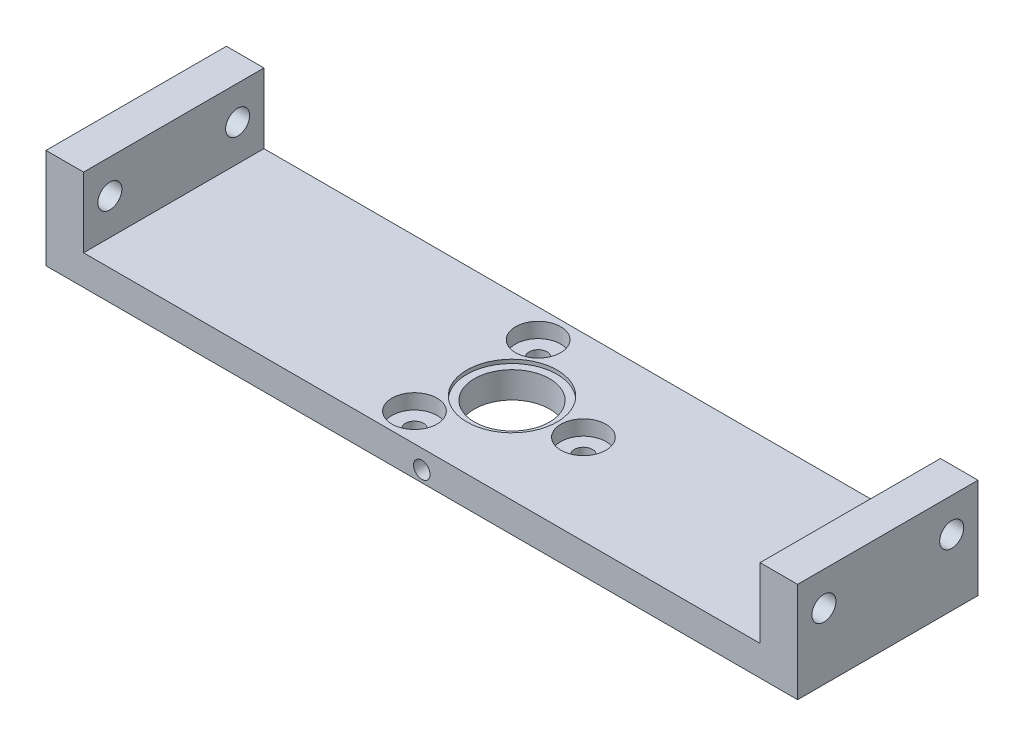
ISO-10303-21;
HEADER;
FILE_DESCRIPTION(('STEP AP214'),'2;1');
FILE_NAME('part.step','',(''),(''),'','','');
FILE_SCHEMA(('AUTOMOTIVE_DESIGN { 1 0 10303 214 1 1 1 1 }'));
ENDSEC;
DATA;
#1=APPLICATION_CONTEXT('core data for automotive mechanical design processes');
#2=APPLICATION_PROTOCOL_DEFINITION('international standard','automotive_design',2000,#1);
#3=PRODUCT_CONTEXT('',#1,'mechanical');
#4=PRODUCT('Part','Part','',(#3));
#5=PRODUCT_RELATED_PRODUCT_CATEGORY('part','',(#4));
#6=PRODUCT_DEFINITION_FORMATION('','',#4);
#7=PRODUCT_DEFINITION_CONTEXT('part definition',#1,'design');
#8=PRODUCT_DEFINITION('design','',#6,#7);
#9=PRODUCT_DEFINITION_SHAPE('','',#8);
#10=(LENGTH_UNIT() NAMED_UNIT(*) SI_UNIT(.MILLI.,.METRE.));
#11=(NAMED_UNIT(*) PLANE_ANGLE_UNIT() SI_UNIT($,.RADIAN.));
#12=(NAMED_UNIT(*) SI_UNIT($,.STERADIAN.) SOLID_ANGLE_UNIT());
#13=UNCERTAINTY_MEASURE_WITH_UNIT(LENGTH_MEASURE(1.E-05),#10,'distance_accuracy_value','');
#14=(GEOMETRIC_REPRESENTATION_CONTEXT(3) GLOBAL_UNCERTAINTY_ASSIGNED_CONTEXT((#13)) GLOBAL_UNIT_ASSIGNED_CONTEXT((#10,
#11,#12)) REPRESENTATION_CONTEXT('',''));
#15=CARTESIAN_POINT('',(0.,0.,0.));
#16=DIRECTION('',(0.,0.,1.));
#17=DIRECTION('',(1.,0.,0.));
#18=AXIS2_PLACEMENT_3D('',#15,#16,#17);
#19=CARTESIAN_POINT('',(0.,0.,0.));
#20=DIRECTION('',(0.,1.,0.));
#21=DIRECTION('',(0.,0.,1.));
#22=AXIS2_PLACEMENT_3D('',#19,#20,#21);
#23=CYLINDRICAL_SURFACE('',#22,5.);
#24=CARTESIAN_POINT('',(0.,0.4,5.));
#25=CARTESIAN_POINT('',(0.0609999595605343,0.400002070744471,4.99999887616071));
#26=CARTESIAN_POINT('',(0.122024864570489,0.405091212620894,4.99887236640976));
#27=CARTESIAN_POINT('',(0.242340682213434,0.425291827060882,4.99448731688896));
#28=CARTESIAN_POINT('',(0.301630334476692,0.440410404510959,4.99122726573313));
#29=CARTESIAN_POINT('',(0.416719495178802,0.480172964020533,4.98293803882235));
#30=CARTESIAN_POINT('',(0.47252259922515,0.504806938177139,4.97791072230238));
#31=CARTESIAN_POINT('',(0.579201800209653,0.562869127389219,4.96662927649014));
#32=CARTESIAN_POINT('',(0.630078013068212,0.59629713546895,4.96037517607224));
#33=CARTESIAN_POINT('',(0.726286472895075,0.671572340540574,4.94721161217635));
#34=CARTESIAN_POINT('',(0.771527352939542,0.713534887419684,4.94029394178491));
#35=CARTESIAN_POINT('',(0.854388619012939,0.804440398808313,4.92664060013215));
#36=CARTESIAN_POINT('',(0.892008319235028,0.853383990846184,4.91990494529707));
#37=CARTESIAN_POINT('',(0.958963471917807,0.957539104713471,4.90729728442084));
#38=CARTESIAN_POINT('',(0.988201468581812,1.01281466135595,4.90143579096535));
#39=CARTESIAN_POINT('',(1.03693806360125,1.12764483611661,4.89135798202062));
#40=CARTESIAN_POINT('',(1.05643784110248,1.18719893517097,4.88714146736376));
#41=CARTESIAN_POINT('',(1.08484213840972,1.30790402706892,4.88091463585407));
#42=CARTESIAN_POINT('',(1.09390852357101,1.36901515579818,4.87887065323906));
#43=CARTESIAN_POINT('',(1.10169200911266,1.4919226238989,4.87711921535008));
#44=CARTESIAN_POINT('',(1.10041039697519,1.55371887707283,4.87741146940503));
#45=CARTESIAN_POINT('',(1.08766448534752,1.6750376788863,4.88026901349544));
#46=CARTESIAN_POINT('',(1.07638840428799,1.73458114182766,4.88279228627149));
#47=CARTESIAN_POINT('',(1.04427191511885,1.85090994244832,4.88976110659631));
#48=CARTESIAN_POINT('',(1.02343096479542,1.90769512356416,4.89420676312045));
#49=CARTESIAN_POINT('',(0.972603991259544,2.01742362343512,4.90456073289075));
#50=CARTESIAN_POINT('',(0.942545752161965,2.07033236312732,4.91048052431651));
#51=CARTESIAN_POINT('',(0.874188211307914,2.17042454548404,4.9231087342744));
#52=CARTESIAN_POINT('',(0.835887773778336,2.21760719769217,4.92981726143629));
#53=CARTESIAN_POINT('',(0.751137532534971,2.30599130859561,4.94344721177288));
#54=CARTESIAN_POINT('',(0.704527725553266,2.3470392724433,4.95037008112472));
#55=CARTESIAN_POINT('',(0.60500727003928,2.42076108260805,4.96351503501933));
#56=CARTESIAN_POINT('',(0.552096504798669,2.45343477377884,4.96973710657756));
#57=CARTESIAN_POINT('',(0.441287511930168,2.50951917630957,4.98079997404393));
#58=CARTESIAN_POINT('',(0.383378689102365,2.53290959052967,4.98563773690336));
#59=CARTESIAN_POINT('',(0.264322427239206,2.56958494318122,4.99336438083546));
#60=CARTESIAN_POINT('',(0.203175466193196,2.58287136866378,4.99625354868486));
#61=CARTESIAN_POINT('',(0.0806951337888037,2.59873790816888,4.99971659049809));
#62=CARTESIAN_POINT('',(0.0193901667559534,2.60152767224174,5.00033579592629));
#63=CARTESIAN_POINT('',(-0.102809855689281,2.59689020331419,4.99931625579903));
#64=CARTESIAN_POINT('',(-0.16370493895761,2.58946367181027,4.99767766527392));
#65=CARTESIAN_POINT('',(-0.282660671832649,2.56477823245189,4.99235527341083));
#66=CARTESIAN_POINT('',(-0.340745292202312,2.54762945611473,4.98869439186058));
#67=CARTESIAN_POINT('',(-0.453213497397116,2.50410869495774,4.97973725216115));
#68=CARTESIAN_POINT('',(-0.507596763912388,2.47773591808446,4.97444085357672));
#69=CARTESIAN_POINT('',(-0.611984174520995,2.41608014452098,4.96268846914328));
#70=CARTESIAN_POINT('',(-0.661913906336793,2.38067420514939,4.95621687062795));
#71=CARTESIAN_POINT('',(-0.755198474721239,2.30211885987565,4.94286351602272));
#72=CARTESIAN_POINT('',(-0.798552445319078,2.25896843572271,4.93598170607748));
#73=CARTESIAN_POINT('',(-0.878285066590893,2.16518648093348,4.9224267180889));
#74=CARTESIAN_POINT('',(-0.914518464326411,2.11443037913633,4.915759829214));
#75=CARTESIAN_POINT('',(-0.977947765230283,2.00743038318787,4.90353605046082));
#76=CARTESIAN_POINT('',(-1.00514406089903,1.95118672750988,4.89797911237922));
#77=CARTESIAN_POINT('',(-1.04954246502567,1.83511055379806,4.88865786141391));
#78=CARTESIAN_POINT('',(-1.06680099884063,1.77530046914941,4.88488345002477));
#79=CARTESIAN_POINT('',(-1.09099877035096,1.65353534619537,4.87953666429121));
#80=CARTESIAN_POINT('',(-1.09793968040361,1.59158065716965,4.87796393308446));
#81=CARTESIAN_POINT('',(-1.10123335923441,1.46875002047652,4.87722125104816));
#82=CARTESIAN_POINT('',(-1.09781649694486,1.40788045337176,4.8779990211444));
#83=CARTESIAN_POINT('',(-1.08100709980942,1.28760725749673,4.88175137242458));
#84=CARTESIAN_POINT('',(-1.06761468536976,1.22820361104154,4.88472592709306));
#85=CARTESIAN_POINT('',(-1.03134622878672,1.11273408423696,4.89251106034219));
#86=CARTESIAN_POINT('',(-1.00850408563874,1.05665708417309,4.89731507127078));
#87=CARTESIAN_POINT('',(-0.954013559326407,0.949097225159446,4.90822032953724));
#88=CARTESIAN_POINT('',(-0.922364246385415,0.897614852024665,4.91432171382331));
#89=CARTESIAN_POINT('',(-0.850395309737892,0.799570860760367,4.92729014360946));
#90=CARTESIAN_POINT('',(-0.809911671979786,0.753131346898307,4.93417029120977));
#91=CARTESIAN_POINT('',(-0.721755168071863,0.667629376971456,4.94783338665195));
#92=CARTESIAN_POINT('',(-0.674080641100263,0.628568629827538,4.95461631164175));
#93=CARTESIAN_POINT('',(-0.572139645762662,0.55844056555829,4.96742659150803));
#94=CARTESIAN_POINT('',(-0.517794695314207,0.527485187588999,4.97344283035884));
#95=CARTESIAN_POINT('',(-0.404551859645521,0.475197401119104,4.98393015925119));
#96=CARTESIAN_POINT('',(-0.345657820131688,0.453856966417843,4.98840253731884));
#97=CARTESIAN_POINT('',(-0.238925637735769,0.425184154059374,4.99450541009833));
#98=CARTESIAN_POINT('',(-0.191662539589551,0.415758204132779,4.99655306675253));
#99=CARTESIAN_POINT('',(-0.0962714475911042,0.403165451708681,4.99930077467044));
#100=CARTESIAN_POINT('',(-0.0481434930158616,0.399998365689539,5.0000008869768));
#101=CARTESIAN_POINT('',(0.,0.4,5.));
#102=B_SPLINE_CURVE_WITH_KNOTS('',3,(#24,#25,#26,#27,#28,#29,#30,#31,#32,#33,#34,#35,#36,#37,
#38,#39,#40,#41,#42,#43,#44,#45,#46,#47,#48,#49,#50,#51,#52,#53,#54,#55,#56,#57,#58,#59,#60,#61,
#62,#63,#64,#65,#66,#67,#68,#69,#70,#71,#72,#73,#74,#75,#76,#77,#78,#79,#80,#81,#82,#83,#84,#85,
#86,#87,#88,#89,#90,#91,#92,#93,#94,#95,#96,#97,#98,#99,#100,#101),.UNSPECIFIED.,.T.,.F.,(4,2,2,
2,2,2,2,2,2,2,2,2,2,2,2,2,2,2,2,2,2,2,2,2,2,2,2,2,2,2,2,2,2,2,2,2,2,2,4),(0.,0.182823646499007,
0.365776944395016,0.548538341185737,0.731295436902254,0.916709868622985,1.10214097782156,
1.28964796472437,1.47713224196011,1.66166688741998,1.84617857371231,2.02728761407923,
2.20840692243349,2.39098318435594,2.57358462137524,2.7601822487278,2.94678333283802,
3.13379018684498,3.32076951285242,3.50399384389164,3.68720559455758,3.86838228153855,
4.04957452975743,4.23337826229003,4.41720617920563,4.6044642781354,4.79171424298788,
4.977890267682,5.1640361122882,5.346072460439,5.52810661142295,5.7094933374829,5.89089921988555,
6.07601342659492,6.26117045329546,6.44876375359555,6.63620016645499,6.78049809308024,
6.92478948297247),.UNSPECIFIED.);
#103=CARTESIAN_POINT('',(0.,0.4,5.));
#104=VERTEX_POINT('',#103);
#105=EDGE_CURVE('E295',#104,#104,#102,.T.);
#106=ORIENTED_EDGE('',*,*,#105,.T.);
#107=EDGE_LOOP('',(#106));
#108=FACE_BOUND('',#107,.T.);
#109=CARTESIAN_POINT('',(0.,0.,0.));
#110=DIRECTION('',(0.,1.,0.));
#111=DIRECTION('',(0.,0.,1.));
#112=AXIS2_PLACEMENT_3D('',#109,#110,#111);
#113=CIRCLE('',#112,5.);
#114=CARTESIAN_POINT('',(0.,0.,5.));
#115=VERTEX_POINT('',#114);
#116=EDGE_CURVE('E224',#115,#115,#113,.T.);
#117=ORIENTED_EDGE('',*,*,#116,.F.);
#118=EDGE_LOOP('',(#117));
#119=FACE_BOUND('',#118,.T.);
#120=CARTESIAN_POINT('',(0.,3.5,0.));
#121=DIRECTION('',(0.,1.,0.));
#122=DIRECTION('',(0.,0.,1.));
#123=AXIS2_PLACEMENT_3D('',#120,#121,#122);
#124=CIRCLE('',#123,5.);
#125=CARTESIAN_POINT('',(0.,3.5,5.));
#126=VERTEX_POINT('',#125);
#127=EDGE_CURVE('E53',#126,#126,#124,.F.);
#128=ORIENTED_EDGE('',*,*,#127,.F.);
#129=EDGE_LOOP('',(#128));
#130=FACE_BOUND('',#129,.T.);
#131=ADVANCED_FACE('F49',(#108,#119,#130),#23,.F.);
#132=CARTESIAN_POINT('',(0.,13.3,0.));
#133=DIRECTION('',(0.,1.,0.));
#134=DIRECTION('',(0.,0.,1.));
#135=AXIS2_PLACEMENT_3D('',#132,#133,#134);
#136=PLANE('',#135);
#137=DIRECTION('',(0.,0.,-1.));
#138=VECTOR('',#137,1.);
#139=CARTESIAN_POINT('',(45.,13.3,-12.));
#140=LINE('',#139,#138);
#141=CARTESIAN_POINT('',(45.,13.3,12.));
#142=VERTEX_POINT('',#141);
#143=CARTESIAN_POINT('',(45.,13.3,-12.));
#144=VERTEX_POINT('',#143);
#145=EDGE_CURVE('E143',#142,#144,#140,.T.);
#146=ORIENTED_EDGE('',*,*,#145,.F.);
#147=DIRECTION('',(1.,0.,0.));
#148=VECTOR('',#147,1.);
#149=CARTESIAN_POINT('',(-50.,13.3,12.));
#150=LINE('',#149,#148);
#151=CARTESIAN_POINT('',(50.,13.3,12.));
#152=VERTEX_POINT('',#151);
#153=EDGE_CURVE('E76',#142,#152,#150,.T.);
#154=ORIENTED_EDGE('',*,*,#153,.T.);
#155=DIRECTION('',(0.,0.,-1.));
#156=VECTOR('',#155,1.);
#157=CARTESIAN_POINT('',(50.,13.3,-12.));
#158=LINE('',#157,#156);
#159=CARTESIAN_POINT('',(50.,13.3,-12.));
#160=VERTEX_POINT('',#159);
#161=EDGE_CURVE('E161',#152,#160,#158,.T.);
#162=ORIENTED_EDGE('',*,*,#161,.T.);
#163=DIRECTION('',(-1.,0.,0.));
#164=VECTOR('',#163,1.);
#165=CARTESIAN_POINT('',(-50.,13.3,-12.));
#166=LINE('',#165,#164);
#167=EDGE_CURVE('E105',#160,#144,#166,.T.);
#168=ORIENTED_EDGE('',*,*,#167,.T.);
#169=EDGE_LOOP('',(#146,#154,#162,#168));
#170=FACE_BOUND('',#169,.T.);
#171=ADVANCED_FACE('F251',(#170),#136,.T.);
#172=CARTESIAN_POINT('',(50.,13.3,-12.));
#173=DIRECTION('',(-1.,0.,0.));
#174=DIRECTION('',(0.,0.,1.));
#175=AXIS2_PLACEMENT_3D('',#172,#173,#174);
#176=PLANE('',#175);
#177=CARTESIAN_POINT('',(50.,8.8,8.5));
#178=DIRECTION('',(1.,0.,0.));
#179=DIRECTION('',(0.,0.,-1.));
#180=AXIS2_PLACEMENT_3D('',#177,#178,#179);
#181=CIRCLE('',#180,1.59999999999999);
#182=CARTESIAN_POINT('',(50.,8.8,6.90000000000001));
#183=VERTEX_POINT('',#182);
#184=EDGE_CURVE('E215',#183,#183,#181,.T.);
#185=ORIENTED_EDGE('',*,*,#184,.F.);
#186=EDGE_LOOP('',(#185));
#187=FACE_BOUND('',#186,.T.);
#188=CARTESIAN_POINT('',(50.,8.8,-8.5));
#189=DIRECTION('',(1.,0.,0.));
#190=DIRECTION('',(0.,0.,-1.));
#191=AXIS2_PLACEMENT_3D('',#188,#189,#190);
#192=CIRCLE('',#191,1.59999999999999);
#193=CARTESIAN_POINT('',(50.,8.8,-10.1));
#194=VERTEX_POINT('',#193);
#195=EDGE_CURVE('E211',#194,#194,#192,.T.);
#196=ORIENTED_EDGE('',*,*,#195,.F.);
#197=EDGE_LOOP('',(#196));
#198=FACE_BOUND('',#197,.T.);
#199=DIRECTION('',(0.,0.,-1.));
#200=VECTOR('',#199,1.);
#201=CARTESIAN_POINT('',(50.,0.,-12.));
#202=LINE('',#201,#200);
#203=CARTESIAN_POINT('',(50.,0.,12.));
#204=VERTEX_POINT('',#203);
#205=CARTESIAN_POINT('',(50.,0.,-12.));
#206=VERTEX_POINT('',#205);
#207=EDGE_CURVE('E174',#204,#206,#202,.T.);
#208=ORIENTED_EDGE('',*,*,#207,.T.);
#209=DIRECTION('',(0.,-1.,0.));
#210=VECTOR('',#209,1.);
#211=CARTESIAN_POINT('',(50.,13.3,-12.));
#212=LINE('',#211,#210);
#213=EDGE_CURVE('E11',#160,#206,#212,.T.);
#214=ORIENTED_EDGE('',*,*,#213,.F.);
#215=ORIENTED_EDGE('',*,*,#161,.F.);
#216=DIRECTION('',(0.,-1.,0.));
#217=VECTOR('',#216,1.);
#218=CARTESIAN_POINT('',(50.,13.3,12.));
#219=LINE('',#218,#217);
#220=EDGE_CURVE('E173',#152,#204,#219,.T.);
#221=ORIENTED_EDGE('',*,*,#220,.T.);
#222=EDGE_LOOP('',(#208,#214,#215,#221));
#223=FACE_BOUND('',#222,.T.);
#224=ADVANCED_FACE('F51',(#187,#198,#223),#176,.F.);
#225=CARTESIAN_POINT('',(-50.,13.3,-12.));
#226=DIRECTION('',(0.,0.,1.));
#227=DIRECTION('',(1.,0.,0.));
#228=AXIS2_PLACEMENT_3D('',#225,#226,#227);
#229=PLANE('',#228);
#230=DIRECTION('',(-1.,0.,0.));
#231=VECTOR('',#230,1.);
#232=CARTESIAN_POINT('',(45.,4.,-12.));
#233=LINE('',#232,#231);
#234=CARTESIAN_POINT('',(45.,4.,-12.));
#235=VERTEX_POINT('',#234);
#236=CARTESIAN_POINT('',(-45.,4.,-12.));
#237=VERTEX_POINT('',#236);
#238=EDGE_CURVE('E135',#235,#237,#233,.T.);
#239=ORIENTED_EDGE('',*,*,#238,.F.);
#240=DIRECTION('',(0.,1.,0.));
#241=VECTOR('',#240,1.);
#242=CARTESIAN_POINT('',(45.,4.,-12.));
#243=LINE('',#242,#241);
#244=EDGE_CURVE('E179',#235,#144,#243,.T.);
#245=ORIENTED_EDGE('',*,*,#244,.T.);
#246=ORIENTED_EDGE('',*,*,#167,.F.);
#247=ORIENTED_EDGE('',*,*,#213,.T.);
#248=DIRECTION('',(-1.,0.,0.));
#249=VECTOR('',#248,1.);
#250=CARTESIAN_POINT('',(-50.,0.,-12.));
#251=LINE('',#250,#249);
#252=CARTESIAN_POINT('',(-50.,0.,-12.));
#253=VERTEX_POINT('',#252);
#254=EDGE_CURVE('E178',#206,#253,#251,.T.);
#255=ORIENTED_EDGE('',*,*,#254,.T.);
#256=DIRECTION('',(0.,-1.,0.));
#257=VECTOR('',#256,1.);
#258=CARTESIAN_POINT('',(-50.,13.3,-12.));
#259=LINE('',#258,#257);
#260=CARTESIAN_POINT('',(-50.,13.3,-12.));
#261=VERTEX_POINT('',#260);
#262=EDGE_CURVE('E59',#261,#253,#259,.T.);
#263=ORIENTED_EDGE('',*,*,#262,.F.);
#264=CARTESIAN_POINT('',(-45.,13.3,-12.));
#265=VERTEX_POINT('',#264);
#266=EDGE_CURVE('E148',#265,#261,#166,.T.);
#267=ORIENTED_EDGE('',*,*,#266,.F.);
#268=DIRECTION('',(0.,1.,0.));
#269=VECTOR('',#268,1.);
#270=CARTESIAN_POINT('',(-45.,4.,-12.));
#271=LINE('',#270,#269);
#272=EDGE_CURVE('E67',#237,#265,#271,.T.);
#273=ORIENTED_EDGE('',*,*,#272,.F.);
#274=EDGE_LOOP('',(#239,#245,#246,#247,#255,#263,#267,#273));
#275=FACE_BOUND('',#274,.T.);
#276=ADVANCED_FACE('F146',(#275),#229,.F.);
#277=CARTESIAN_POINT('',(-50.,13.3,-12.));
#278=DIRECTION('',(1.,0.,0.));
#279=DIRECTION('',(0.,0.,-1.));
#280=AXIS2_PLACEMENT_3D('',#277,#278,#279);
#281=PLANE('',#280);
#282=CARTESIAN_POINT('',(-50.,8.8,8.5));
#283=DIRECTION('',(1.,0.,0.));
#284=DIRECTION('',(0.,0.,-1.));
#285=AXIS2_PLACEMENT_3D('',#282,#283,#284);
#286=CIRCLE('',#285,1.59999999999998);
#287=CARTESIAN_POINT('',(-50.,8.8,6.90000000000002));
#288=VERTEX_POINT('',#287);
#289=EDGE_CURVE('E204',#288,#288,#286,.T.);
#290=ORIENTED_EDGE('',*,*,#289,.T.);
#291=EDGE_LOOP('',(#290));
#292=FACE_BOUND('',#291,.T.);
#293=CARTESIAN_POINT('',(-50.,8.8,-8.5));
#294=DIRECTION('',(1.,0.,0.));
#295=DIRECTION('',(0.,0.,-1.));
#296=AXIS2_PLACEMENT_3D('',#293,#294,#295);
#297=CIRCLE('',#296,1.59999999999998);
#298=CARTESIAN_POINT('',(-50.,8.8,-10.1));
#299=VERTEX_POINT('',#298);
#300=EDGE_CURVE('E199',#299,#299,#297,.T.);
#301=ORIENTED_EDGE('',*,*,#300,.T.);
#302=EDGE_LOOP('',(#301));
#303=FACE_BOUND('',#302,.T.);
#304=DIRECTION('',(0.,0.,1.));
#305=VECTOR('',#304,1.);
#306=CARTESIAN_POINT('',(-50.,0.,-12.));
#307=LINE('',#306,#305);
#308=CARTESIAN_POINT('',(-50.,0.,12.));
#309=VERTEX_POINT('',#308);
#310=EDGE_CURVE('E182',#253,#309,#307,.T.);
#311=ORIENTED_EDGE('',*,*,#310,.T.);
#312=DIRECTION('',(0.,-1.,0.));
#313=VECTOR('',#312,1.);
#314=CARTESIAN_POINT('',(-50.,13.3,12.));
#315=LINE('',#314,#313);
#316=CARTESIAN_POINT('',(-50.,13.3,12.));
#317=VERTEX_POINT('',#316);
#318=EDGE_CURVE('E189',#317,#309,#315,.T.);
#319=ORIENTED_EDGE('',*,*,#318,.F.);
#320=DIRECTION('',(0.,0.,1.));
#321=VECTOR('',#320,1.);
#322=CARTESIAN_POINT('',(-50.,13.3,-12.));
#323=LINE('',#322,#321);
#324=EDGE_CURVE('E166',#261,#317,#323,.T.);
#325=ORIENTED_EDGE('',*,*,#324,.F.);
#326=ORIENTED_EDGE('',*,*,#262,.T.);
#327=EDGE_LOOP('',(#311,#319,#325,#326));
#328=FACE_BOUND('',#327,.T.);
#329=ADVANCED_FACE('F388',(#292,#303,#328),#281,.F.);
#330=CARTESIAN_POINT('',(-50.,13.3,12.));
#331=DIRECTION('',(0.,0.,-1.));
#332=DIRECTION('',(-1.,0.,0.));
#333=AXIS2_PLACEMENT_3D('',#330,#331,#332);
#334=PLANE('',#333);
#335=CARTESIAN_POINT('',(0.,1.5,12.));
#336=DIRECTION('',(0.,0.,1.));
#337=DIRECTION('',(1.,0.,0.));
#338=AXIS2_PLACEMENT_3D('',#335,#336,#337);
#339=CIRCLE('',#338,1.1);
#340=CARTESIAN_POINT('',(1.09999999999999,1.5,12.));
#341=VERTEX_POINT('',#340);
#342=EDGE_CURVE('E300',#341,#341,#339,.T.);
#343=ORIENTED_EDGE('',*,*,#342,.F.);
#344=EDGE_LOOP('',(#343));
#345=FACE_BOUND('',#344,.T.);
#346=ORIENTED_EDGE('',*,*,#153,.F.);
#347=DIRECTION('',(0.,1.,0.));
#348=VECTOR('',#347,1.);
#349=CARTESIAN_POINT('',(45.,4.,12.));
#350=LINE('',#349,#348);
#351=CARTESIAN_POINT('',(45.,4.,12.));
#352=VERTEX_POINT('',#351);
#353=EDGE_CURVE('E155',#352,#142,#350,.T.);
#354=ORIENTED_EDGE('',*,*,#353,.F.);
#355=DIRECTION('',(1.,0.,0.));
#356=VECTOR('',#355,1.);
#357=CARTESIAN_POINT('',(-45.,4.,12.));
#358=LINE('',#357,#356);
#359=CARTESIAN_POINT('',(-45.,4.,12.));
#360=VERTEX_POINT('',#359);
#361=EDGE_CURVE('E134',#360,#352,#358,.T.);
#362=ORIENTED_EDGE('',*,*,#361,.F.);
#363=DIRECTION('',(0.,1.,0.));
#364=VECTOR('',#363,1.);
#365=CARTESIAN_POINT('',(-45.,4.,12.));
#366=LINE('',#365,#364);
#367=CARTESIAN_POINT('',(-45.,13.3,12.));
#368=VERTEX_POINT('',#367);
#369=EDGE_CURVE('E130',#360,#368,#366,.T.);
#370=ORIENTED_EDGE('',*,*,#369,.T.);
#371=EDGE_CURVE('E169',#317,#368,#150,.T.);
#372=ORIENTED_EDGE('',*,*,#371,.F.);
#373=ORIENTED_EDGE('',*,*,#318,.T.);
#374=DIRECTION('',(1.,0.,0.));
#375=VECTOR('',#374,1.);
#376=CARTESIAN_POINT('',(-50.,0.,12.));
#377=LINE('',#376,#375);
#378=EDGE_CURVE('E98',#309,#204,#377,.T.);
#379=ORIENTED_EDGE('',*,*,#378,.T.);
#380=ORIENTED_EDGE('',*,*,#220,.F.);
#381=EDGE_LOOP('',(#346,#354,#362,#370,#372,#373,#379,#380));
#382=FACE_BOUND('',#381,.T.);
#383=ADVANCED_FACE('F252',(#345,#382),#334,.F.);
#384=DIRECTION('',(0.,0.,1.));
#385=VECTOR('',#384,1.);
#386=CARTESIAN_POINT('',(-45.,13.3,-12.));
#387=LINE('',#386,#385);
#388=EDGE_CURVE('E235',#265,#368,#387,.T.);
#389=ORIENTED_EDGE('',*,*,#388,.F.);
#390=ORIENTED_EDGE('',*,*,#266,.T.);
#391=ORIENTED_EDGE('',*,*,#324,.T.);
#392=ORIENTED_EDGE('',*,*,#371,.T.);
#393=EDGE_LOOP('',(#389,#390,#391,#392));
#394=FACE_BOUND('',#393,.T.);
#395=ADVANCED_FACE('F369',(#394),#136,.T.);
#396=CARTESIAN_POINT('',(0.,0.,0.));
#397=DIRECTION('',(0.,1.,0.));
#398=DIRECTION('',(0.,0.,1.));
#399=AXIS2_PLACEMENT_3D('',#396,#397,#398);
#400=PLANE('',#399);
#401=CARTESIAN_POINT('',(-4.74999999999992,0.,8.2272413359522));
#402=DIRECTION('',(0.,1.,0.));
#403=DIRECTION('',(0.,0.,1.));
#404=AXIS2_PLACEMENT_3D('',#401,#402,#403);
#405=CIRCLE('',#404,1.2);
#406=CARTESIAN_POINT('',(-4.74999999999992,0.,9.4272413359522));
#407=VERTEX_POINT('',#406);
#408=EDGE_CURVE('E413',#407,#407,#405,.T.);
#409=ORIENTED_EDGE('',*,*,#408,.T.);
#410=EDGE_LOOP('',(#409));
#411=FACE_BOUND('',#410,.T.);
#412=CARTESIAN_POINT('',(-4.75000000000003,0.,-8.22724133595214));
#413=DIRECTION('',(0.,1.,0.));
#414=DIRECTION('',(0.,0.,1.));
#415=AXIS2_PLACEMENT_3D('',#412,#413,#414);
#416=CIRCLE('',#415,1.2);
#417=CARTESIAN_POINT('',(-4.75000000000003,0.,-7.02724133595214));
#418=VERTEX_POINT('',#417);
#419=EDGE_CURVE('E430',#418,#418,#416,.T.);
#420=ORIENTED_EDGE('',*,*,#419,.T.);
#421=EDGE_LOOP('',(#420));
#422=FACE_BOUND('',#421,.T.);
#423=CARTESIAN_POINT('',(9.49999999999999,0.,0.));
#424=DIRECTION('',(0.,1.,0.));
#425=DIRECTION('',(0.,0.,1.));
#426=AXIS2_PLACEMENT_3D('',#423,#424,#425);
#427=CIRCLE('',#426,1.2);
#428=CARTESIAN_POINT('',(9.49999999999999,0.,1.2));
#429=VERTEX_POINT('',#428);
#430=EDGE_CURVE('E269',#429,#429,#427,.T.);
#431=ORIENTED_EDGE('',*,*,#430,.T.);
#432=EDGE_LOOP('',(#431));
#433=FACE_BOUND('',#432,.T.);
#434=ORIENTED_EDGE('',*,*,#116,.T.);
#435=EDGE_LOOP('',(#434));
#436=FACE_BOUND('',#435,.T.);
#437=ORIENTED_EDGE('',*,*,#207,.F.);
#438=ORIENTED_EDGE('',*,*,#378,.F.);
#439=ORIENTED_EDGE('',*,*,#310,.F.);
#440=ORIENTED_EDGE('',*,*,#254,.F.);
#441=EDGE_LOOP('',(#437,#438,#439,#440));
#442=FACE_BOUND('',#441,.T.);
#443=ADVANCED_FACE('F377',(#411,#422,#433,#436,#442),#400,.F.);
#444=CARTESIAN_POINT('',(45.,4.,-12.));
#445=DIRECTION('',(1.,0.,0.));
#446=DIRECTION('',(0.,0.,-1.));
#447=AXIS2_PLACEMENT_3D('',#444,#445,#446);
#448=PLANE('',#447);
#449=CARTESIAN_POINT('',(45.,8.8,8.5));
#450=DIRECTION('',(1.,0.,0.));
#451=DIRECTION('',(0.,0.,-1.));
#452=AXIS2_PLACEMENT_3D('',#449,#450,#451);
#453=CIRCLE('',#452,1.59999999999998);
#454=CARTESIAN_POINT('',(45.,8.8,6.90000000000002));
#455=VERTEX_POINT('',#454);
#456=EDGE_CURVE('E200',#455,#455,#453,.T.);
#457=ORIENTED_EDGE('',*,*,#456,.T.);
#458=EDGE_LOOP('',(#457));
#459=FACE_BOUND('',#458,.T.);
#460=CARTESIAN_POINT('',(45.,8.8,-8.5));
#461=DIRECTION('',(1.,0.,0.));
#462=DIRECTION('',(0.,0.,-1.));
#463=AXIS2_PLACEMENT_3D('',#460,#461,#462);
#464=CIRCLE('',#463,1.59999999999998);
#465=CARTESIAN_POINT('',(45.,8.8,-10.1));
#466=VERTEX_POINT('',#465);
#467=EDGE_CURVE('E198',#466,#466,#464,.T.);
#468=ORIENTED_EDGE('',*,*,#467,.T.);
#469=EDGE_LOOP('',(#468));
#470=FACE_BOUND('',#469,.T.);
#471=ORIENTED_EDGE('',*,*,#145,.T.);
#472=ORIENTED_EDGE('',*,*,#244,.F.);
#473=DIRECTION('',(0.,0.,-1.));
#474=VECTOR('',#473,1.);
#475=CARTESIAN_POINT('',(45.,4.,-12.));
#476=LINE('',#475,#474);
#477=EDGE_CURVE('E141',#352,#235,#476,.T.);
#478=ORIENTED_EDGE('',*,*,#477,.F.);
#479=ORIENTED_EDGE('',*,*,#353,.T.);
#480=EDGE_LOOP('',(#471,#472,#478,#479));
#481=FACE_BOUND('',#480,.T.);
#482=ADVANCED_FACE('F250',(#459,#470,#481),#448,.F.);
#483=CARTESIAN_POINT('',(-45.,4.,-12.));
#484=DIRECTION('',(-1.,0.,0.));
#485=DIRECTION('',(0.,0.,1.));
#486=AXIS2_PLACEMENT_3D('',#483,#484,#485);
#487=PLANE('',#486);
#488=CARTESIAN_POINT('',(-45.,8.8,8.5));
#489=DIRECTION('',(-1.,0.,0.));
#490=DIRECTION('',(0.,0.,1.));
#491=AXIS2_PLACEMENT_3D('',#488,#489,#490);
#492=CIRCLE('',#491,1.59999999999998);
#493=CARTESIAN_POINT('',(-45.,8.8,10.1));
#494=VERTEX_POINT('',#493);
#495=EDGE_CURVE('E203',#494,#494,#492,.T.);
#496=ORIENTED_EDGE('',*,*,#495,.T.);
#497=EDGE_LOOP('',(#496));
#498=FACE_BOUND('',#497,.T.);
#499=CARTESIAN_POINT('',(-45.,8.8,-8.5));
#500=DIRECTION('',(-1.,0.,0.));
#501=DIRECTION('',(0.,0.,1.));
#502=AXIS2_PLACEMENT_3D('',#499,#500,#501);
#503=CIRCLE('',#502,1.59999999999998);
#504=CARTESIAN_POINT('',(-45.,8.8,-6.90000000000002));
#505=VERTEX_POINT('',#504);
#506=EDGE_CURVE('E195',#505,#505,#503,.T.);
#507=ORIENTED_EDGE('',*,*,#506,.T.);
#508=EDGE_LOOP('',(#507));
#509=FACE_BOUND('',#508,.T.);
#510=ORIENTED_EDGE('',*,*,#388,.T.);
#511=ORIENTED_EDGE('',*,*,#369,.F.);
#512=DIRECTION('',(0.,0.,1.));
#513=VECTOR('',#512,1.);
#514=CARTESIAN_POINT('',(-45.,4.,-12.));
#515=LINE('',#514,#513);
#516=EDGE_CURVE('E126',#237,#360,#515,.T.);
#517=ORIENTED_EDGE('',*,*,#516,.F.);
#518=ORIENTED_EDGE('',*,*,#272,.T.);
#519=EDGE_LOOP('',(#510,#511,#517,#518));
#520=FACE_BOUND('',#519,.T.);
#521=ADVANCED_FACE('F128',(#498,#509,#520),#487,.F.);
#522=CARTESIAN_POINT('',(0.,4.,0.));
#523=DIRECTION('',(0.,1.,0.));
#524=DIRECTION('',(0.,0.,1.));
#525=AXIS2_PLACEMENT_3D('',#522,#523,#524);
#526=PLANE('',#525);
#527=CARTESIAN_POINT('',(-4.74999999999992,4.,8.2272413359522));
#528=DIRECTION('',(0.,1.,0.));
#529=DIRECTION('',(0.,0.,1.));
#530=AXIS2_PLACEMENT_3D('',#527,#528,#529);
#531=CIRCLE('',#530,3.);
#532=CARTESIAN_POINT('',(-4.74999999999992,4.,11.2272413359522));
#533=VERTEX_POINT('',#532);
#534=EDGE_CURVE('E286',#533,#533,#531,.T.);
#535=ORIENTED_EDGE('',*,*,#534,.F.);
#536=EDGE_LOOP('',(#535));
#537=FACE_BOUND('',#536,.T.);
#538=CARTESIAN_POINT('',(-4.75000000000003,4.,-8.22724133595214));
#539=DIRECTION('',(0.,1.,0.));
#540=DIRECTION('',(0.,0.,1.));
#541=AXIS2_PLACEMENT_3D('',#538,#539,#540);
#542=CIRCLE('',#541,3.);
#543=CARTESIAN_POINT('',(-4.75000000000003,4.,-5.22724133595214));
#544=VERTEX_POINT('',#543);
#545=EDGE_CURVE('E415',#544,#544,#542,.T.);
#546=ORIENTED_EDGE('',*,*,#545,.F.);
#547=EDGE_LOOP('',(#546));
#548=FACE_BOUND('',#547,.T.);
#549=CARTESIAN_POINT('',(9.49999999999999,4.,0.));
#550=DIRECTION('',(0.,1.,0.));
#551=DIRECTION('',(0.,0.,1.));
#552=AXIS2_PLACEMENT_3D('',#549,#550,#551);
#553=CIRCLE('',#552,3.);
#554=CARTESIAN_POINT('',(9.49999999999999,4.,3.));
#555=VERTEX_POINT('',#554);
#556=EDGE_CURVE('E406',#555,#555,#553,.T.);
#557=ORIENTED_EDGE('',*,*,#556,.F.);
#558=EDGE_LOOP('',(#557));
#559=FACE_BOUND('',#558,.T.);
#560=CARTESIAN_POINT('',(0.,4.,0.));
#561=DIRECTION('',(0.,1.,0.));
#562=DIRECTION('',(0.,0.,1.));
#563=AXIS2_PLACEMENT_3D('',#560,#561,#562);
#564=CIRCLE('',#563,6.);
#565=CARTESIAN_POINT('',(0.,4.,6.));
#566=VERTEX_POINT('',#565);
#567=EDGE_CURVE('E410',#566,#566,#564,.T.);
#568=ORIENTED_EDGE('',*,*,#567,.F.);
#569=EDGE_LOOP('',(#568));
#570=FACE_BOUND('',#569,.T.);
#571=ORIENTED_EDGE('',*,*,#238,.T.);
#572=ORIENTED_EDGE('',*,*,#516,.T.);
#573=ORIENTED_EDGE('',*,*,#361,.T.);
#574=ORIENTED_EDGE('',*,*,#477,.T.);
#575=EDGE_LOOP('',(#571,#572,#573,#574));
#576=FACE_BOUND('',#575,.T.);
#577=ADVANCED_FACE('F139',(#537,#548,#559,#570,#576),#526,.T.);
#578=CARTESIAN_POINT('',(50.,8.8,-8.5));
#579=DIRECTION('',(1.,0.,0.));
#580=DIRECTION('',(0.,0.,-1.));
#581=AXIS2_PLACEMENT_3D('',#578,#579,#580);
#582=CYLINDRICAL_SURFACE('',#581,1.59999999999998);
#583=ORIENTED_EDGE('',*,*,#300,.F.);
#584=EDGE_LOOP('',(#583));
#585=FACE_BOUND('',#584,.T.);
#586=ORIENTED_EDGE('',*,*,#506,.F.);
#587=EDGE_LOOP('',(#586));
#588=FACE_BOUND('',#587,.T.);
#589=ADVANCED_FACE('F455',(#585,#588),#582,.F.);
#590=ORIENTED_EDGE('',*,*,#195,.T.);
#591=EDGE_LOOP('',(#590));
#592=FACE_BOUND('',#591,.T.);
#593=ORIENTED_EDGE('',*,*,#467,.F.);
#594=EDGE_LOOP('',(#593));
#595=FACE_BOUND('',#594,.T.);
#596=ADVANCED_FACE('F461',(#592,#595),#582,.F.);
#597=CARTESIAN_POINT('',(50.,8.8,8.5));
#598=DIRECTION('',(1.,0.,0.));
#599=DIRECTION('',(0.,0.,-1.));
#600=AXIS2_PLACEMENT_3D('',#597,#598,#599);
#601=CYLINDRICAL_SURFACE('',#600,1.59999999999998);
#602=ORIENTED_EDGE('',*,*,#184,.T.);
#603=EDGE_LOOP('',(#602));
#604=FACE_BOUND('',#603,.T.);
#605=ORIENTED_EDGE('',*,*,#456,.F.);
#606=EDGE_LOOP('',(#605));
#607=FACE_BOUND('',#606,.T.);
#608=ADVANCED_FACE('F487',(#604,#607),#601,.F.);
#609=ORIENTED_EDGE('',*,*,#289,.F.);
#610=EDGE_LOOP('',(#609));
#611=FACE_BOUND('',#610,.T.);
#612=ORIENTED_EDGE('',*,*,#495,.F.);
#613=EDGE_LOOP('',(#612));
#614=FACE_BOUND('',#613,.T.);
#615=ADVANCED_FACE('F357',(#611,#614),#601,.F.);
#616=CARTESIAN_POINT('',(0.,3.5,0.));
#617=DIRECTION('',(0.,1.,0.));
#618=DIRECTION('',(0.,0.,1.));
#619=AXIS2_PLACEMENT_3D('',#616,#617,#618);
#620=PLANE('',#619);
#621=CARTESIAN_POINT('',(0.,3.5,0.));
#622=DIRECTION('',(0.,1.,0.));
#623=DIRECTION('',(0.,0.,1.));
#624=AXIS2_PLACEMENT_3D('',#621,#622,#623);
#625=CIRCLE('',#624,6.);
#626=CARTESIAN_POINT('',(0.,3.5,6.));
#627=VERTEX_POINT('',#626);
#628=EDGE_CURVE('E263',#627,#627,#625,.T.);
#629=ORIENTED_EDGE('',*,*,#628,.T.);
#630=EDGE_LOOP('',(#629));
#631=FACE_BOUND('',#630,.T.);
#632=ORIENTED_EDGE('',*,*,#127,.T.);
#633=EDGE_LOOP('',(#632));
#634=FACE_BOUND('',#633,.T.);
#635=ADVANCED_FACE('F355',(#631,#634),#620,.T.);
#636=CARTESIAN_POINT('',(0.,3.5,0.));
#637=DIRECTION('',(0.,1.,0.));
#638=DIRECTION('',(0.,0.,1.));
#639=AXIS2_PLACEMENT_3D('',#636,#637,#638);
#640=CYLINDRICAL_SURFACE('',#639,6.);
#641=ORIENTED_EDGE('',*,*,#628,.F.);
#642=EDGE_LOOP('',(#641));
#643=FACE_BOUND('',#642,.T.);
#644=ORIENTED_EDGE('',*,*,#567,.T.);
#645=EDGE_LOOP('',(#644));
#646=FACE_BOUND('',#645,.T.);
#647=ADVANCED_FACE('F353',(#643,#646),#640,.F.);
#648=CARTESIAN_POINT('',(9.49999999999999,4.,0.));
#649=DIRECTION('',(0.,1.,0.));
#650=DIRECTION('',(0.,0.,1.));
#651=AXIS2_PLACEMENT_3D('',#648,#649,#650);
#652=CYLINDRICAL_SURFACE('',#651,1.2);
#653=ORIENTED_EDGE('',*,*,#430,.F.);
#654=EDGE_LOOP('',(#653));
#655=FACE_BOUND('',#654,.T.);
#656=CARTESIAN_POINT('',(9.49999999999999,2.,0.));
#657=DIRECTION('',(0.,1.,0.));
#658=DIRECTION('',(0.,0.,1.));
#659=AXIS2_PLACEMENT_3D('',#656,#657,#658);
#660=CIRCLE('',#659,1.2);
#661=CARTESIAN_POINT('',(9.49999999999999,2.,1.2));
#662=VERTEX_POINT('',#661);
#663=EDGE_CURVE('E266',#662,#662,#660,.T.);
#664=ORIENTED_EDGE('',*,*,#663,.T.);
#665=EDGE_LOOP('',(#664));
#666=FACE_BOUND('',#665,.T.);
#667=ADVANCED_FACE('F349',(#655,#666),#652,.F.);
#668=CARTESIAN_POINT('',(10.7,2.,0.));
#669=DIRECTION('',(0.,-1.,0.));
#670=DIRECTION('',(0.,0.,-1.));
#671=AXIS2_PLACEMENT_3D('',#668,#669,#670);
#672=PLANE('',#671);
#673=ORIENTED_EDGE('',*,*,#663,.F.);
#674=EDGE_LOOP('',(#673));
#675=FACE_BOUND('',#674,.T.);
#676=CARTESIAN_POINT('',(9.49999999999999,2.,0.));
#677=DIRECTION('',(0.,1.,0.));
#678=DIRECTION('',(0.,0.,1.));
#679=AXIS2_PLACEMENT_3D('',#676,#677,#678);
#680=CIRCLE('',#679,3.);
#681=CARTESIAN_POINT('',(9.49999999999999,2.,3.));
#682=VERTEX_POINT('',#681);
#683=EDGE_CURVE('E270',#682,#682,#680,.T.);
#684=ORIENTED_EDGE('',*,*,#683,.T.);
#685=EDGE_LOOP('',(#684));
#686=FACE_BOUND('',#685,.T.);
#687=ADVANCED_FACE('F345',(#675,#686),#672,.F.);
#688=CARTESIAN_POINT('',(9.49999999999999,4.,0.));
#689=DIRECTION('',(0.,1.,0.));
#690=DIRECTION('',(0.,0.,1.));
#691=AXIS2_PLACEMENT_3D('',#688,#689,#690);
#692=CYLINDRICAL_SURFACE('',#691,3.);
#693=ORIENTED_EDGE('',*,*,#683,.F.);
#694=EDGE_LOOP('',(#693));
#695=FACE_BOUND('',#694,.T.);
#696=ORIENTED_EDGE('',*,*,#556,.T.);
#697=EDGE_LOOP('',(#696));
#698=FACE_BOUND('',#697,.T.);
#699=ADVANCED_FACE('F341',(#695,#698),#692,.F.);
#700=CARTESIAN_POINT('',(-4.75000000000003,4.,-8.22724133595214));
#701=DIRECTION('',(0.,1.,0.));
#702=DIRECTION('',(0.,0.,1.));
#703=AXIS2_PLACEMENT_3D('',#700,#701,#702);
#704=CYLINDRICAL_SURFACE('',#703,1.2);
#705=ORIENTED_EDGE('',*,*,#419,.F.);
#706=EDGE_LOOP('',(#705));
#707=FACE_BOUND('',#706,.T.);
#708=CARTESIAN_POINT('',(-4.75000000000003,2.,-8.22724133595214));
#709=DIRECTION('',(0.,1.,0.));
#710=DIRECTION('',(0.,0.,1.));
#711=AXIS2_PLACEMENT_3D('',#708,#709,#710);
#712=CIRCLE('',#711,1.2);
#713=CARTESIAN_POINT('',(-4.75000000000003,2.,-7.02724133595214));
#714=VERTEX_POINT('',#713);
#715=EDGE_CURVE('E425',#714,#714,#712,.T.);
#716=ORIENTED_EDGE('',*,*,#715,.T.);
#717=EDGE_LOOP('',(#716));
#718=FACE_BOUND('',#717,.T.);
#719=ADVANCED_FACE('F337',(#707,#718),#704,.F.);
#720=CARTESIAN_POINT('',(-3.55000000000003,2.,-8.22724133595214));
#721=DIRECTION('',(0.,-1.,0.));
#722=DIRECTION('',(0.,0.,-1.));
#723=AXIS2_PLACEMENT_3D('',#720,#721,#722);
#724=PLANE('',#723);
#725=ORIENTED_EDGE('',*,*,#715,.F.);
#726=EDGE_LOOP('',(#725));
#727=FACE_BOUND('',#726,.T.);
#728=CARTESIAN_POINT('',(-4.75000000000003,2.,-8.22724133595214));
#729=DIRECTION('',(0.,1.,0.));
#730=DIRECTION('',(0.,0.,1.));
#731=AXIS2_PLACEMENT_3D('',#728,#729,#730);
#732=CIRCLE('',#731,3.);
#733=CARTESIAN_POINT('',(-4.75000000000003,2.,-5.22724133595214));
#734=VERTEX_POINT('',#733);
#735=EDGE_CURVE('E420',#734,#734,#732,.T.);
#736=ORIENTED_EDGE('',*,*,#735,.T.);
#737=EDGE_LOOP('',(#736));
#738=FACE_BOUND('',#737,.T.);
#739=ADVANCED_FACE('F333',(#727,#738),#724,.F.);
#740=CARTESIAN_POINT('',(-4.75000000000003,4.,-8.22724133595214));
#741=DIRECTION('',(0.,1.,0.));
#742=DIRECTION('',(0.,0.,1.));
#743=AXIS2_PLACEMENT_3D('',#740,#741,#742);
#744=CYLINDRICAL_SURFACE('',#743,3.);
#745=ORIENTED_EDGE('',*,*,#735,.F.);
#746=EDGE_LOOP('',(#745));
#747=FACE_BOUND('',#746,.T.);
#748=ORIENTED_EDGE('',*,*,#545,.T.);
#749=EDGE_LOOP('',(#748));
#750=FACE_BOUND('',#749,.T.);
#751=ADVANCED_FACE('F329',(#747,#750),#744,.F.);
#752=CARTESIAN_POINT('',(-4.74999999999992,4.,8.2272413359522));
#753=DIRECTION('',(0.,1.,0.));
#754=DIRECTION('',(0.,0.,1.));
#755=AXIS2_PLACEMENT_3D('',#752,#753,#754);
#756=CYLINDRICAL_SURFACE('',#755,1.2);
#757=ORIENTED_EDGE('',*,*,#408,.F.);
#758=EDGE_LOOP('',(#757));
#759=FACE_BOUND('',#758,.T.);
#760=CARTESIAN_POINT('',(-4.74999999999992,2.,8.2272413359522));
#761=DIRECTION('',(0.,1.,0.));
#762=DIRECTION('',(0.,0.,1.));
#763=AXIS2_PLACEMENT_3D('',#760,#761,#762);
#764=CIRCLE('',#763,1.2);
#765=CARTESIAN_POINT('',(-4.74999999999992,2.,9.4272413359522));
#766=VERTEX_POINT('',#765);
#767=EDGE_CURVE('E285',#766,#766,#764,.T.);
#768=ORIENTED_EDGE('',*,*,#767,.T.);
#769=EDGE_LOOP('',(#768));
#770=FACE_BOUND('',#769,.T.);
#771=ADVANCED_FACE('F325',(#759,#770),#756,.F.);
#772=CARTESIAN_POINT('',(-3.54999999999992,2.,8.2272413359522));
#773=DIRECTION('',(0.,-1.,0.));
#774=DIRECTION('',(0.,0.,-1.));
#775=AXIS2_PLACEMENT_3D('',#772,#773,#774);
#776=PLANE('',#775);
#777=ORIENTED_EDGE('',*,*,#767,.F.);
#778=EDGE_LOOP('',(#777));
#779=FACE_BOUND('',#778,.T.);
#780=CARTESIAN_POINT('',(-4.74999999999992,2.,8.2272413359522));
#781=DIRECTION('',(0.,1.,0.));
#782=DIRECTION('',(0.,0.,1.));
#783=AXIS2_PLACEMENT_3D('',#780,#781,#782);
#784=CIRCLE('',#783,3.);
#785=CARTESIAN_POINT('',(-4.74999999999992,2.,11.2272413359522));
#786=VERTEX_POINT('',#785);
#787=EDGE_CURVE('E282',#786,#786,#784,.T.);
#788=ORIENTED_EDGE('',*,*,#787,.T.);
#789=EDGE_LOOP('',(#788));
#790=FACE_BOUND('',#789,.T.);
#791=ADVANCED_FACE('F321',(#779,#790),#776,.F.);
#792=CARTESIAN_POINT('',(-4.74999999999992,4.,8.2272413359522));
#793=DIRECTION('',(0.,1.,0.));
#794=DIRECTION('',(0.,0.,1.));
#795=AXIS2_PLACEMENT_3D('',#792,#793,#794);
#796=CYLINDRICAL_SURFACE('',#795,3.);
#797=ORIENTED_EDGE('',*,*,#787,.F.);
#798=EDGE_LOOP('',(#797));
#799=FACE_BOUND('',#798,.T.);
#800=ORIENTED_EDGE('',*,*,#534,.T.);
#801=EDGE_LOOP('',(#800));
#802=FACE_BOUND('',#801,.T.);
#803=ADVANCED_FACE('F318',(#799,#802),#796,.F.);
#804=CARTESIAN_POINT('',(0.,1.5,2.));
#805=DIRECTION('',(0.,0.,1.));
#806=DIRECTION('',(1.,0.,0.));
#807=AXIS2_PLACEMENT_3D('',#804,#805,#806);
#808=CYLINDRICAL_SURFACE('',#807,1.1);
#809=ORIENTED_EDGE('',*,*,#342,.T.);
#810=EDGE_LOOP('',(#809));
#811=FACE_BOUND('',#810,.T.);
#812=ORIENTED_EDGE('',*,*,#105,.F.);
#813=EDGE_LOOP('',(#812));
#814=FACE_BOUND('',#813,.T.);
#815=ADVANCED_FACE('F314',(#811,#814),#808,.F.);
#816=CLOSED_SHELL('',(#131,#171,#224,#276,#329,#383,#395,#443,#482,#521,#577,#589,#596,#608,
#615,#635,#647,#667,#687,#699,#719,#739,#751,#771,#791,#803,#815));
#817=MANIFOLD_SOLID_BREP('B2',#816);
#818=ADVANCED_BREP_SHAPE_REPRESENTATION('',(#18,#817),#14);
#819=SHAPE_DEFINITION_REPRESENTATION(#9,#818);
ENDSEC;
END-ISO-10303-21;
